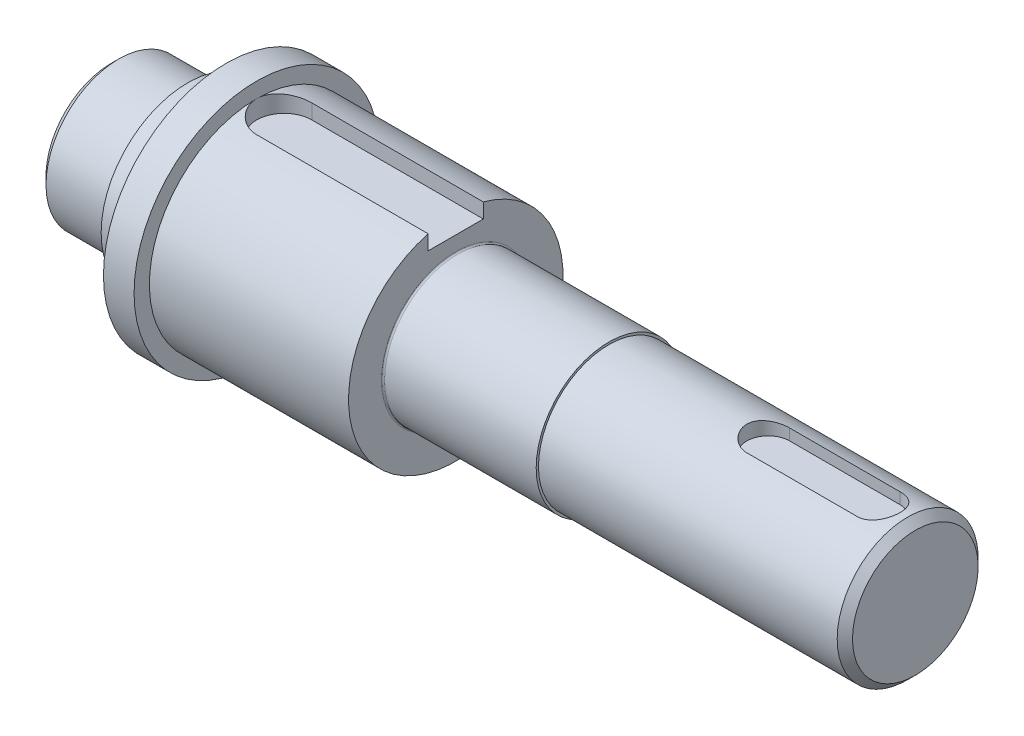
ISO-10303-21;
HEADER;
FILE_DESCRIPTION(('STEP AP214'),'2;1');
FILE_NAME('part.step','',(''),(''),'','','');
FILE_SCHEMA(('AUTOMOTIVE_DESIGN { 1 0 10303 214 1 1 1 1 }'));
ENDSEC;
DATA;
#1=APPLICATION_CONTEXT('core data for automotive mechanical design processes');
#2=APPLICATION_PROTOCOL_DEFINITION('international standard','automotive_design',2000,#1);
#3=PRODUCT_CONTEXT('',#1,'mechanical');
#4=PRODUCT('Part','Part','',(#3));
#5=PRODUCT_RELATED_PRODUCT_CATEGORY('part','',(#4));
#6=PRODUCT_DEFINITION_FORMATION('','',#4);
#7=PRODUCT_DEFINITION_CONTEXT('part definition',#1,'design');
#8=PRODUCT_DEFINITION('design','',#6,#7);
#9=PRODUCT_DEFINITION_SHAPE('','',#8);
#10=(LENGTH_UNIT() NAMED_UNIT(*) SI_UNIT(.MILLI.,.METRE.));
#11=(NAMED_UNIT(*) PLANE_ANGLE_UNIT() SI_UNIT($,.RADIAN.));
#12=(NAMED_UNIT(*) SI_UNIT($,.STERADIAN.) SOLID_ANGLE_UNIT());
#13=UNCERTAINTY_MEASURE_WITH_UNIT(LENGTH_MEASURE(1.E-05),#10,'distance_accuracy_value','');
#14=(GEOMETRIC_REPRESENTATION_CONTEXT(3) GLOBAL_UNCERTAINTY_ASSIGNED_CONTEXT((#13)) GLOBAL_UNIT_ASSIGNED_CONTEXT((#10,
#11,#12)) REPRESENTATION_CONTEXT('',''));
#15=CARTESIAN_POINT('',(0.,0.,0.));
#16=DIRECTION('',(0.,0.,1.));
#17=DIRECTION('',(1.,0.,0.));
#18=AXIS2_PLACEMENT_3D('',#15,#16,#17);
#19=CARTESIAN_POINT('',(0.,0.,0.));
#20=DIRECTION('',(-1.,0.,0.));
#21=DIRECTION('',(0.,0.,1.));
#22=AXIS2_PLACEMENT_3D('',#19,#20,#21);
#23=CYLINDRICAL_SURFACE('',#22,46.);
#24=CARTESIAN_POINT('',(520.,0.,0.));
#25=DIRECTION('',(-1.,0.,0.));
#26=DIRECTION('',(0.,0.,1.));
#27=AXIS2_PLACEMENT_3D('',#24,#25,#26);
#28=CIRCLE('',#27,46.);
#29=CARTESIAN_POINT('',(520.,0.,46.));
#30=VERTEX_POINT('',#29);
#31=EDGE_CURVE('E245',#30,#30,#28,.T.);
#32=ORIENTED_EDGE('',*,*,#31,.T.);
#33=EDGE_LOOP('',(#32));
#34=FACE_BOUND('',#33,.T.);
#35=CARTESIAN_POINT('',(325.,0.,0.));
#36=DIRECTION('',(-1.,0.,0.));
#37=DIRECTION('',(0.,0.,1.));
#38=AXIS2_PLACEMENT_3D('',#35,#36,#37);
#39=CIRCLE('',#38,46.);
#40=CARTESIAN_POINT('',(325.,0.,46.));
#41=VERTEX_POINT('',#40);
#42=EDGE_CURVE('E161',#41,#41,#39,.T.);
#43=ORIENTED_EDGE('',*,*,#42,.F.);
#44=EDGE_LOOP('',(#43));
#45=FACE_BOUND('',#44,.T.);
#46=CARTESIAN_POINT('',(429.,43.8178046004132,-14.0000000000001));
#47=CARTESIAN_POINT('',(428.808016477527,43.8178026072066,-14.0000003791292));
#48=CARTESIAN_POINT('',(428.616057469204,43.8190667976287,-13.99605026024));
#49=CARTESIAN_POINT('',(428.232499752168,43.8241064703167,-13.9802643563665));
#50=CARTESIAN_POINT('',(428.040901038226,43.827881915848,-13.9684286867325));
#51=CARTESIAN_POINT('',(427.467278153187,43.8429390022549,-13.921130548521));
#52=CARTESIAN_POINT('',(427.086251672709,43.85795143055,-13.8738769198669));
#53=CARTESIAN_POINT('',(426.330876614656,43.8974057431773,-13.7485286148941));
#54=CARTESIAN_POINT('',(425.95651333438,43.9218231794544,-13.6705138888366));
#55=CARTESIAN_POINT('',(425.21602607631,43.979338463641,-13.4843343320782));
#56=CARTESIAN_POINT('',(424.849902324338,44.0124365491475,-13.3761686761147));
#57=CARTESIAN_POINT('',(424.128570041615,44.0863032877923,-13.1306613713317));
#58=CARTESIAN_POINT('',(423.773356636915,44.127068456107,-12.9933329738432));
#59=CARTESIAN_POINT('',(423.075949739745,44.2150957029651,-12.6905536424603));
#60=CARTESIAN_POINT('',(422.733756875908,44.262358094688,-12.5251013528452));
#61=CARTESIAN_POINT('',(422.064390600993,44.3620680529808,-12.1672272126644));
#62=CARTESIAN_POINT('',(421.737223497765,44.4145177685855,-11.9747941704494));
#63=CARTESIAN_POINT('',(421.10001443105,44.5231534041412,-11.5643359403464));
#64=CARTESIAN_POINT('',(420.789972801354,44.5793393968688,-11.3463102538913));
#65=CARTESIAN_POINT('',(420.180071702229,44.6956252321281,-10.8793671747307));
#66=CARTESIAN_POINT('',(419.88077200868,44.7557914099423,-10.6297348612851));
#67=CARTESIAN_POINT('',(419.303969163493,44.876869851041,-10.1063697698827));
#68=CARTESIAN_POINT('',(419.026475540252,44.9377824271816,-9.83262656600234));
#69=CARTESIAN_POINT('',(418.495126988898,45.0586884101858,-9.26279793942464));
#70=CARTESIAN_POINT('',(418.241276404025,45.1186816464817,-8.96670842971182));
#71=CARTESIAN_POINT('',(417.759044456002,45.236096214272,-8.35420718603722));
#72=CARTESIAN_POINT('',(417.530651777924,45.2935186815159,-8.03780457969973));
#73=CARTESIAN_POINT('',(417.096127077171,45.4054749499475,-7.37947806297961));
#74=CARTESIAN_POINT('',(416.890583458574,45.4599193952635,-7.0371501391523));
#75=CARTESIAN_POINT('',(416.509165147539,45.5630028202005,-6.33549475097594));
#76=CARTESIAN_POINT('',(416.33329100782,45.6116416916635,-5.97616697009315));
#77=CARTESIAN_POINT('',(416.012695451283,45.7017111709396,-5.24308386316691));
#78=CARTESIAN_POINT('',(415.867967388245,45.7431433162238,-4.86933163525164));
#79=CARTESIAN_POINT('',(415.610892009398,45.8176064559995,-4.11003923085635));
#80=CARTESIAN_POINT('',(415.49854355103,45.8506377469214,-3.7244994708461));
#81=CARTESIAN_POINT('',(415.310078236466,45.9064929940652,-2.95600123483271));
#82=CARTESIAN_POINT('',(415.232994064423,45.9295882763462,-2.57329958310961));
#83=CARTESIAN_POINT('',(415.111017386373,45.9662968471682,-1.80234863934502));
#84=CARTESIAN_POINT('',(415.066124309098,45.9799103039754,-1.41409944587609));
#85=CARTESIAN_POINT('',(415.008958840718,45.9972661100852,-0.635051333034734));
#86=CARTESIAN_POINT('',(414.996681035649,46.0010100976674,-0.244252847629227));
#87=CARTESIAN_POINT('',(415.004849027199,45.9985242425766,0.536966322970943));
#88=CARTESIAN_POINT('',(415.025294204118,45.9922945887819,0.927387015180056));
#89=CARTESIAN_POINT('',(415.097502699141,45.9704068181765,1.69209973135658));
#90=CARTESIAN_POINT('',(415.148216047953,45.9550648795091,2.06650053081219));
#91=CARTESIAN_POINT('',(415.279617148035,45.9156289366815,2.80952425705504));
#92=CARTESIAN_POINT('',(415.360304127961,45.8915351577423,3.17814733227237));
#93=CARTESIAN_POINT('',(415.55096802643,45.8352285284632,3.90710663009459));
#94=CARTESIAN_POINT('',(415.660945699974,45.8030154688411,4.26744263883112));
#95=CARTESIAN_POINT('',(415.909296921979,45.7313063730948,4.97744378220474));
#96=CARTESIAN_POINT('',(416.047671019999,45.6918101960217,5.3271087101736));
#97=CARTESIAN_POINT('',(416.35355207776,45.606039593013,6.01760992518801));
#98=CARTESIAN_POINT('',(416.521384591041,45.5596904452226,6.35829265088755));
#99=CARTESIAN_POINT('',(416.883790247992,45.4617654028304,7.02432948759955));
#100=CARTESIAN_POINT('',(417.078363499788,45.4101894870943,7.34968353662296));
#101=CARTESIAN_POINT('',(417.492896932306,45.3031272744725,7.98309710684045));
#102=CARTESIAN_POINT('',(417.712856446663,45.247641080243,8.29115708167298));
#103=CARTESIAN_POINT('',(418.176834707228,45.1341367141294,8.88831446917412));
#104=CARTESIAN_POINT('',(418.420864373929,45.0761173996982,9.17740317471239));
#105=CARTESIAN_POINT('',(418.941500110936,44.9567205222528,9.74581598323813));
#106=CARTESIAN_POINT('',(419.219013037016,44.8953009103207,10.0243012828142));
#107=CARTESIAN_POINT('',(419.796417045997,44.7730541259373,10.5569062883511));
#108=CARTESIAN_POINT('',(420.096299167083,44.7122267271512,10.8110356598299));
#109=CARTESIAN_POINT('',(420.716817056786,44.5928065796725,11.2935119741496));
#110=CARTESIAN_POINT('',(421.037463680165,44.5342150256325,11.5218452579556));
#111=CARTESIAN_POINT('',(421.69733277494,44.4209784105452,11.9509807485822));
#112=CARTESIAN_POINT('',(422.036554705086,44.3663332346152,12.1517837569873));
#113=CARTESIAN_POINT('',(422.735131415444,44.2620384936384,12.5263792545818));
#114=CARTESIAN_POINT('',(423.094663250483,44.2124488637307,12.6998585948245));
#115=CARTESIAN_POINT('',(423.828003810823,44.1204855666143,13.0157532969176));
#116=CARTESIAN_POINT('',(424.201811779981,44.0781115178751,13.1581703013294));
#117=CARTESIAN_POINT('',(424.960571212164,44.0019854056831,13.4105429885953));
#118=CARTESIAN_POINT('',(425.34550827732,43.9682227124759,13.5205387182566));
#119=CARTESIAN_POINT('',(426.12392348623,43.9103771939569,13.7072353102855));
#120=CARTESIAN_POINT('',(426.517397607768,43.8862899101779,13.7839515092993));
#121=CARTESIAN_POINT('',(427.258796483396,43.8510332529464,13.8956826672918));
#122=CARTESIAN_POINT('',(427.606048603897,43.838598221824,13.9348007256099));
#123=CARTESIAN_POINT('',(428.302191616069,43.8219713702484,13.986956751027));
#124=CARTESIAN_POINT('',(428.651079389642,43.8177675867537,14.0000325675922));
#125=CARTESIAN_POINT('',(429.,43.8178046004133,13.9999999999999));
#126=B_SPLINE_CURVE_WITH_KNOTS('',3,(#46,#47,#48,#49,#50,#51,#52,#53,#54,#55,#56,#57,#58,#59,
#60,#61,#62,#63,#64,#65,#66,#67,#68,#69,#70,#71,#72,#73,#74,#75,#76,#77,#78,#79,#80,#81,#82,#83,
#84,#85,#86,#87,#88,#89,#90,#91,#92,#93,#94,#95,#96,#97,#98,#99,#100,#101,#102,#103,#104,#105,
#106,#107,#108,#109,#110,#111,#112,#113,#114,#115,#116,#117,#118,#119,#120,#121,#122,#123,#124,
#125),.UNSPECIFIED.,.F.,.F.,(4,2,2,2,2,2,2,2,2,2,2,2,2,2,2,2,2,2,2,2,2,2,2,2,2,2,2,2,2,2,2,2,2,
2,2,2,2,2,2,4),(0.,0.57585700293327,1.15170558236791,2.30287781424274,3.45107758427866,
4.59930878483595,5.74701934990801,6.89478525641502,8.04302867394113,9.19129446396926,
10.3730125531588,11.5552441681183,12.7376925331311,13.9196132381011,15.1271007637685,
16.3346107814537,17.5418628741533,18.749072362151,19.9208218247336,21.0925504926876,
22.2640846476332,23.4355966166192,24.5686565021775,25.7016872314902,26.8347471687432,
27.9678290362114,29.1143274042595,30.2608304083411,31.4073033245966,32.5542988028446,
33.7466727172167,34.938571467959,36.131098400401,37.3235906032877,38.5288861302863,
39.734117906379,40.9378546789789,42.1410361268011,43.1889921391357,44.2354239506839),.UNSPECIFIED.);
#127=CARTESIAN_POINT('',(429.,43.8178046004132,-14.));
#128=VERTEX_POINT('',#127);
#129=CARTESIAN_POINT('',(429.,43.8178046004132,14.));
#130=VERTEX_POINT('',#129);
#131=EDGE_CURVE('E111',#128,#130,#126,.T.);
#132=ORIENTED_EDGE('',*,*,#131,.F.);
#133=DIRECTION('',(-1.,0.,0.));
#134=VECTOR('',#133,1.);
#135=CARTESIAN_POINT('',(0.,43.8178046004132,-14.));
#136=LINE('',#135,#134);
#137=CARTESIAN_POINT('',(501.,43.8178046004132,-14.));
#138=VERTEX_POINT('',#137);
#139=EDGE_CURVE('E198',#138,#128,#136,.T.);
#140=ORIENTED_EDGE('',*,*,#139,.F.);
#141=CARTESIAN_POINT('',(501.,43.8178046004133,14.));
#142=CARTESIAN_POINT('',(501.191983522473,43.8178026072067,14.0000003791291));
#143=CARTESIAN_POINT('',(501.383942530796,43.8190667976287,13.9960502602399));
#144=CARTESIAN_POINT('',(501.767500247832,43.8241064703168,13.9802643563664));
#145=CARTESIAN_POINT('',(501.959098961775,43.827881915848,13.9684286867325));
#146=CARTESIAN_POINT('',(502.532721846813,43.8429390022549,13.921130548521));
#147=CARTESIAN_POINT('',(502.913748327291,43.85795143055,13.8738769198668));
#148=CARTESIAN_POINT('',(503.669123385345,43.8974057431773,13.7485286148941));
#149=CARTESIAN_POINT('',(504.04348666562,43.9218231794544,13.6705138888365));
#150=CARTESIAN_POINT('',(504.78397392369,43.979338463641,13.4843343320781));
#151=CARTESIAN_POINT('',(505.150097675662,44.0124365491475,13.3761686761146));
#152=CARTESIAN_POINT('',(505.871429958385,44.0863032877923,13.1306613713316));
#153=CARTESIAN_POINT('',(506.226643363086,44.1270684561071,12.9933329738431));
#154=CARTESIAN_POINT('',(506.924050260256,44.2150957029651,12.6905536424603));
#155=CARTESIAN_POINT('',(507.266243124093,44.262358094688,12.5251013528451));
#156=CARTESIAN_POINT('',(507.935609399007,44.3620680529808,12.1672272126643));
#157=CARTESIAN_POINT('',(508.262776502235,44.4145177685856,11.9747941704493));
#158=CARTESIAN_POINT('',(508.899985568951,44.5231534041412,11.5643359403463));
#159=CARTESIAN_POINT('',(509.210027198646,44.5793393968688,11.3463102538913));
#160=CARTESIAN_POINT('',(509.819928297771,44.6956252321281,10.8793671747306));
#161=CARTESIAN_POINT('',(510.119227991321,44.7557914099423,10.629734861285));
#162=CARTESIAN_POINT('',(510.696030836507,44.876869851041,10.1063697698826));
#163=CARTESIAN_POINT('',(510.973524459748,44.9377824271816,9.83262656600228));
#164=CARTESIAN_POINT('',(511.504873011103,45.0586884101859,9.26279793942458));
#165=CARTESIAN_POINT('',(511.758723595975,45.1186816464817,8.96670842971175));
#166=CARTESIAN_POINT('',(512.240955543998,45.236096214272,8.35420718603713));
#167=CARTESIAN_POINT('',(512.469348222076,45.2935186815159,8.03780457969964));
#168=CARTESIAN_POINT('',(512.903872922829,45.4054749499475,7.37947806297949));
#169=CARTESIAN_POINT('',(513.109416541427,45.4599193952635,7.03715013915216));
#170=CARTESIAN_POINT('',(513.490834852461,45.5630028202005,6.33549475097581));
#171=CARTESIAN_POINT('',(513.66670899218,45.6116416916635,5.97616697009305));
#172=CARTESIAN_POINT('',(513.987304548718,45.7017111709396,5.24308386316684));
#173=CARTESIAN_POINT('',(514.132032611755,45.7431433162238,4.86933163525157));
#174=CARTESIAN_POINT('',(514.389107990602,45.8176064559995,4.11003923085629));
#175=CARTESIAN_POINT('',(514.50145644897,45.8506377469214,3.72449947084604));
#176=CARTESIAN_POINT('',(514.689921763534,45.9064929940652,2.95600123483265));
#177=CARTESIAN_POINT('',(514.767005935578,45.9295882763462,2.57329958310956));
#178=CARTESIAN_POINT('',(514.888982613627,45.9662968471682,1.80234863934498));
#179=CARTESIAN_POINT('',(514.933875690903,45.9799103039754,1.41409944587604));
#180=CARTESIAN_POINT('',(514.991041159282,45.9972661100852,0.635051333034675));
#181=CARTESIAN_POINT('',(515.003318964351,46.0010100976674,0.244252847629169));
#182=CARTESIAN_POINT('',(514.995150972801,45.9985242425766,-0.536966322970998));
#183=CARTESIAN_POINT('',(514.974705795882,45.9922945887819,-0.927387015180106));
#184=CARTESIAN_POINT('',(514.90249730086,45.9704068181765,-1.69209973135663));
#185=CARTESIAN_POINT('',(514.851783952048,45.9550648795091,-2.06650053081226));
#186=CARTESIAN_POINT('',(514.720382851965,45.9156289366815,-2.80952425705511));
#187=CARTESIAN_POINT('',(514.639695872039,45.8915351577423,-3.17814733227242));
#188=CARTESIAN_POINT('',(514.44903197357,45.8352285284632,-3.90710663009465));
#189=CARTESIAN_POINT('',(514.339054300027,45.8030154688411,-4.26744263883119));
#190=CARTESIAN_POINT('',(514.090703078021,45.7313063730948,-4.97744378220482));
#191=CARTESIAN_POINT('',(513.952328980002,45.6918101960217,-5.32710871017367));
#192=CARTESIAN_POINT('',(513.64644792224,45.6060395930129,-6.01760992518806));
#193=CARTESIAN_POINT('',(513.478615408959,45.5596904452225,-6.35829265088759));
#194=CARTESIAN_POINT('',(513.116209752009,45.4617654028304,-7.0243294875996));
#195=CARTESIAN_POINT('',(512.921636500213,45.4101894870943,-7.34968353662302));
#196=CARTESIAN_POINT('',(512.507103067694,45.3031272744725,-7.98309710684051));
#197=CARTESIAN_POINT('',(512.287143553338,45.247641080243,-8.29115708167303));
#198=CARTESIAN_POINT('',(511.823165292773,45.1341367141294,-8.88831446917416));
#199=CARTESIAN_POINT('',(511.579135626071,45.0761173996982,-9.17740317471244));
#200=CARTESIAN_POINT('',(511.058499889064,44.9567205222528,-9.74581598323818));
#201=CARTESIAN_POINT('',(510.780986962984,44.8953009103207,-10.0243012828143));
#202=CARTESIAN_POINT('',(510.203582954003,44.7730541259373,-10.5569062883511));
#203=CARTESIAN_POINT('',(509.903700832917,44.7122267271512,-10.8110356598299));
#204=CARTESIAN_POINT('',(509.283182943214,44.5928065796725,-11.2935119741496));
#205=CARTESIAN_POINT('',(508.962536319835,44.5342150256325,-11.5218452579556));
#206=CARTESIAN_POINT('',(508.30266722506,44.4209784105452,-11.9509807485822));
#207=CARTESIAN_POINT('',(507.963445294915,44.3663332346153,-12.1517837569873));
#208=CARTESIAN_POINT('',(507.264868584556,44.2620384936384,-12.5263792545818));
#209=CARTESIAN_POINT('',(506.905336749517,44.2124488637307,-12.6998585948245));
#210=CARTESIAN_POINT('',(506.171996189177,44.1204855666143,-13.0157532969177));
#211=CARTESIAN_POINT('',(505.798188220019,44.0781115178751,-13.1581703013295));
#212=CARTESIAN_POINT('',(505.039428787837,44.0019854056831,-13.4105429885953));
#213=CARTESIAN_POINT('',(504.65449172268,43.9682227124759,-13.5205387182566));
#214=CARTESIAN_POINT('',(503.87607651377,43.9103771939569,-13.7072353102856));
#215=CARTESIAN_POINT('',(503.482602392233,43.8862899101779,-13.7839515092993));
#216=CARTESIAN_POINT('',(502.741203516604,43.8510332529464,-13.8956826672918));
#217=CARTESIAN_POINT('',(502.393951396103,43.838598221824,-13.9348007256099));
#218=CARTESIAN_POINT('',(501.697808383931,43.8219713702484,-13.986956751027));
#219=CARTESIAN_POINT('',(501.348920610359,43.8177675867536,-14.0000325675923));
#220=CARTESIAN_POINT('',(501.,43.8178046004133,-14.));
#221=B_SPLINE_CURVE_WITH_KNOTS('',3,(#141,#142,#143,#144,#145,#146,#147,#148,#149,#150,#151,
#152,#153,#154,#155,#156,#157,#158,#159,#160,#161,#162,#163,#164,#165,#166,#167,#168,#169,#170,
#171,#172,#173,#174,#175,#176,#177,#178,#179,#180,#181,#182,#183,#184,#185,#186,#187,#188,#189,
#190,#191,#192,#193,#194,#195,#196,#197,#198,#199,#200,#201,#202,#203,#204,#205,#206,#207,#208,
#209,#210,#211,#212,#213,#214,#215,#216,#217,#218,#219,#220),.UNSPECIFIED.,.F.,.F.,(4,2,2,2,2,2,
2,2,2,2,2,2,2,2,2,2,2,2,2,2,2,2,2,2,2,2,2,2,2,2,2,2,2,2,2,2,2,2,2,4),(0.,0.57585700293327,
1.1517055823678,2.30287781424268,3.45107758427866,4.59930878483595,5.74701934990807,
6.89478525641508,8.04302867394125,9.19129446396919,10.3730125531588,11.5552441681183,
12.7376925331312,13.9196132381012,15.1271007637686,16.3346107814537,17.5418628741533,
18.749072362151,19.9208218247336,21.0925504926876,22.2640846476332,23.4355966166192,
24.5686565021775,25.7016872314902,26.8347471687432,27.9678290362113,29.1143274042594,
30.2608304083411,31.4073033245966,32.5542988028445,33.7466727172166,34.9385714679589,
36.1310984004008,37.3235906032876,38.5288861302862,39.7341179063789,40.9378546789788,
42.141036126801,43.1889921391357,44.235423950684),.UNSPECIFIED.);
#222=CARTESIAN_POINT('',(501.,43.8178046004133,14.));
#223=VERTEX_POINT('',#222);
#224=EDGE_CURVE('E232',#223,#138,#221,.T.);
#225=ORIENTED_EDGE('',*,*,#224,.F.);
#226=DIRECTION('',(-1.,0.,0.));
#227=VECTOR('',#226,1.);
#228=CARTESIAN_POINT('',(0.,43.8178046004132,14.0000000000001));
#229=LINE('',#228,#227);
#230=EDGE_CURVE('E246',#130,#223,#229,.F.);
#231=ORIENTED_EDGE('',*,*,#230,.F.);
#232=EDGE_LOOP('',(#132,#140,#225,#231));
#233=FACE_BOUND('',#232,.T.);
#234=ADVANCED_FACE('F34',(#34,#45,#233),#23,.T.);
#235=CARTESIAN_POINT('',(0.,0.,0.));
#236=DIRECTION('',(1.,0.,0.));
#237=DIRECTION('',(0.,0.,-1.));
#238=AXIS2_PLACEMENT_3D('',#235,#236,#237);
#239=PLANE('',#238);
#240=CARTESIAN_POINT('',(0.,0.,0.));
#241=DIRECTION('',(1.,0.,0.));
#242=DIRECTION('',(0.,0.,-1.));
#243=AXIS2_PLACEMENT_3D('',#240,#241,#242);
#244=CIRCLE('',#243,42.5000000000001);
#245=CARTESIAN_POINT('',(0.,0.,-42.5000000000001));
#246=VERTEX_POINT('',#245);
#247=EDGE_CURVE('E329',#246,#246,#244,.F.);
#248=ORIENTED_EDGE('',*,*,#247,.T.);
#249=EDGE_LOOP('',(#248));
#250=FACE_BOUND('',#249,.T.);
#251=ADVANCED_FACE('F228',(#250),#239,.F.);
#252=CARTESIAN_POINT('',(0.,0.,0.));
#253=DIRECTION('',(-1.,0.,0.));
#254=DIRECTION('',(0.,0.,1.));
#255=AXIS2_PLACEMENT_3D('',#252,#253,#254);
#256=CYLINDRICAL_SURFACE('',#255,47.5);
#257=CARTESIAN_POINT('',(4.99999999999992,0.,0.));
#258=DIRECTION('',(1.,0.,0.));
#259=DIRECTION('',(0.,0.,-1.));
#260=AXIS2_PLACEMENT_3D('',#257,#258,#259);
#261=CIRCLE('',#260,47.5);
#262=CARTESIAN_POINT('',(4.99999999999992,0.,-47.5));
#263=VERTEX_POINT('',#262);
#264=EDGE_CURVE('E327',#263,#263,#261,.T.);
#265=ORIENTED_EDGE('',*,*,#264,.T.);
#266=EDGE_LOOP('',(#265));
#267=FACE_BOUND('',#266,.T.);
#268=CARTESIAN_POINT('',(50.,0.,0.));
#269=DIRECTION('',(-1.,0.,0.));
#270=DIRECTION('',(0.,0.,1.));
#271=AXIS2_PLACEMENT_3D('',#268,#269,#270);
#272=CIRCLE('',#271,47.5);
#273=CARTESIAN_POINT('',(50.,0.,47.5));
#274=VERTEX_POINT('',#273);
#275=EDGE_CURVE('E185',#274,#274,#272,.T.);
#276=ORIENTED_EDGE('',*,*,#275,.T.);
#277=EDGE_LOOP('',(#276));
#278=FACE_BOUND('',#277,.T.);
#279=ADVANCED_FACE('F277',(#267,#278),#256,.T.);
#280=CARTESIAN_POINT('',(50.,47.5,0.));
#281=DIRECTION('',(1.,0.,0.));
#282=DIRECTION('',(0.,0.,-1.));
#283=AXIS2_PLACEMENT_3D('',#280,#281,#282);
#284=PLANE('',#283);
#285=ORIENTED_EDGE('',*,*,#275,.F.);
#286=EDGE_LOOP('',(#285));
#287=FACE_BOUND('',#286,.T.);
#288=CARTESIAN_POINT('',(50.,0.,0.));
#289=DIRECTION('',(-1.,0.,0.));
#290=DIRECTION('',(0.,0.,1.));
#291=AXIS2_PLACEMENT_3D('',#288,#289,#290);
#292=CIRCLE('',#291,56.4999999999999);
#293=CARTESIAN_POINT('',(50.,0.,56.4999999999999));
#294=VERTEX_POINT('',#293);
#295=EDGE_CURVE('E182',#294,#294,#292,.T.);
#296=ORIENTED_EDGE('',*,*,#295,.T.);
#297=EDGE_LOOP('',(#296));
#298=FACE_BOUND('',#297,.T.);
#299=ADVANCED_FACE('F281',(#287,#298),#284,.F.);
#300=CARTESIAN_POINT('',(0.,0.,0.));
#301=DIRECTION('',(-1.,0.,0.));
#302=DIRECTION('',(0.,0.,1.));
#303=AXIS2_PLACEMENT_3D('',#300,#301,#302);
#304=CYLINDRICAL_SURFACE('',#303,56.4999999999999);
#305=ORIENTED_EDGE('',*,*,#295,.F.);
#306=EDGE_LOOP('',(#305));
#307=FACE_BOUND('',#306,.T.);
#308=CARTESIAN_POINT('',(75.,0.,0.));
#309=DIRECTION('',(-1.,0.,0.));
#310=DIRECTION('',(0.,0.,1.));
#311=AXIS2_PLACEMENT_3D('',#308,#309,#310);
#312=CIRCLE('',#311,56.4999999999999);
#313=CARTESIAN_POINT('',(75.,0.,56.4999999999999));
#314=VERTEX_POINT('',#313);
#315=EDGE_CURVE('E179',#314,#314,#312,.T.);
#316=ORIENTED_EDGE('',*,*,#315,.T.);
#317=EDGE_LOOP('',(#316));
#318=FACE_BOUND('',#317,.T.);
#319=ADVANCED_FACE('F285',(#307,#318),#304,.T.);
#320=CARTESIAN_POINT('',(75.,56.4999999999999,0.));
#321=DIRECTION('',(1.,0.,0.));
#322=DIRECTION('',(0.,0.,-1.));
#323=AXIS2_PLACEMENT_3D('',#320,#321,#322);
#324=PLANE('',#323);
#325=ORIENTED_EDGE('',*,*,#315,.F.);
#326=EDGE_LOOP('',(#325));
#327=FACE_BOUND('',#326,.T.);
#328=CARTESIAN_POINT('',(75.,0.,0.));
#329=DIRECTION('',(-1.,0.,0.));
#330=DIRECTION('',(0.,0.,1.));
#331=AXIS2_PLACEMENT_3D('',#328,#329,#330);
#332=CIRCLE('',#331,79.9999999999999);
#333=CARTESIAN_POINT('',(75.,0.,79.9999999999999));
#334=VERTEX_POINT('',#333);
#335=EDGE_CURVE('E176',#334,#334,#332,.T.);
#336=ORIENTED_EDGE('',*,*,#335,.T.);
#337=EDGE_LOOP('',(#336));
#338=FACE_BOUND('',#337,.T.);
#339=ADVANCED_FACE('F289',(#327,#338),#324,.F.);
#340=CARTESIAN_POINT('',(0.,0.,0.));
#341=DIRECTION('',(-1.,0.,0.));
#342=DIRECTION('',(0.,0.,1.));
#343=AXIS2_PLACEMENT_3D('',#340,#341,#342);
#344=CYLINDRICAL_SURFACE('',#343,79.9999999999999);
#345=ORIENTED_EDGE('',*,*,#335,.F.);
#346=EDGE_LOOP('',(#345));
#347=FACE_BOUND('',#346,.T.);
#348=CARTESIAN_POINT('',(95.,0.,0.));
#349=DIRECTION('',(-1.,0.,0.));
#350=DIRECTION('',(0.,0.,1.));
#351=AXIS2_PLACEMENT_3D('',#348,#349,#350);
#352=CIRCLE('',#351,79.9999999999999);
#353=CARTESIAN_POINT('',(95.,0.,79.9999999999999));
#354=VERTEX_POINT('',#353);
#355=EDGE_CURVE('E173',#354,#354,#352,.T.);
#356=ORIENTED_EDGE('',*,*,#355,.T.);
#357=EDGE_LOOP('',(#356));
#358=FACE_BOUND('',#357,.T.);
#359=ADVANCED_FACE('F293',(#347,#358),#344,.T.);
#360=CARTESIAN_POINT('',(95.,79.9999999999999,0.));
#361=DIRECTION('',(-1.,0.,0.));
#362=DIRECTION('',(0.,0.,1.));
#363=AXIS2_PLACEMENT_3D('',#360,#361,#362);
#364=PLANE('',#363);
#365=ORIENTED_EDGE('',*,*,#355,.F.);
#366=EDGE_LOOP('',(#365));
#367=FACE_BOUND('',#366,.T.);
#368=CARTESIAN_POINT('',(95.,0.,0.));
#369=DIRECTION('',(-1.,0.,0.));
#370=DIRECTION('',(0.,0.,1.));
#371=AXIS2_PLACEMENT_3D('',#368,#369,#370);
#372=CIRCLE('',#371,70.);
#373=CARTESIAN_POINT('',(95.,70.,0.));
#374=VERTEX_POINT('',#373);
#375=EDGE_CURVE('E170',#374,#374,#372,.T.);
#376=ORIENTED_EDGE('',*,*,#375,.T.);
#377=EDGE_LOOP('',(#376));
#378=FACE_BOUND('',#377,.T.);
#379=ADVANCED_FACE('F296',(#367,#378),#364,.F.);
#380=CARTESIAN_POINT('',(0.,0.,0.));
#381=DIRECTION('',(-1.,0.,0.));
#382=DIRECTION('',(0.,0.,1.));
#383=AXIS2_PLACEMENT_3D('',#380,#381,#382);
#384=CYLINDRICAL_SURFACE('',#383,70.);
#385=CARTESIAN_POINT('',(225.,0.,0.));
#386=DIRECTION('',(-1.,0.,0.));
#387=DIRECTION('',(0.,0.,1.));
#388=AXIS2_PLACEMENT_3D('',#385,#386,#387);
#389=CIRCLE('',#388,70.);
#390=CARTESIAN_POINT('',(225.,67.646138101151,-18.));
#391=VERTEX_POINT('',#390);
#392=CARTESIAN_POINT('',(225.,67.646138101151,18.));
#393=VERTEX_POINT('',#392);
#394=EDGE_CURVE('E167',#391,#393,#389,.T.);
#395=ORIENTED_EDGE('',*,*,#394,.T.);
#396=DIRECTION('',(-1.,0.,0.));
#397=VECTOR('',#396,1.);
#398=CARTESIAN_POINT('',(0.,67.646138101151,18.));
#399=LINE('',#398,#397);
#400=CARTESIAN_POINT('',(113.,67.646138101151,18.));
#401=VERTEX_POINT('',#400);
#402=EDGE_CURVE('E158',#393,#401,#399,.T.);
#403=ORIENTED_EDGE('',*,*,#402,.T.);
#404=CARTESIAN_POINT('',(113.,67.646138101151,18.));
#405=CARTESIAN_POINT('',(112.751337850749,67.6461360267012,18.0000002617822));
#406=CARTESIAN_POINT('',(112.502707038729,67.6475096882484,17.9948463683339));
#407=CARTESIAN_POINT('',(112.005909815661,67.6529863333406,17.9742483702358));
#408=CARTESIAN_POINT('',(111.75774339047,67.6570892323631,17.9588045842571));
#409=CARTESIAN_POINT('',(111.014713220962,67.6734544385533,17.8970810950666));
#410=CARTESIAN_POINT('',(110.521124167261,67.6897732885077,17.8354092297225));
#411=CARTESIAN_POINT('',(109.542253006459,67.7326897308545,17.6717239977381));
#412=CARTESIAN_POINT('',(109.056955952655,67.7592661967937,17.5697935371889));
#413=CARTESIAN_POINT('',(108.096970533372,67.8219014363319,17.3264381130102));
#414=CARTESIAN_POINT('',(107.622282330832,67.8579603554623,17.1850125432294));
#415=CARTESIAN_POINT('',(106.686909806986,67.9384865365431,16.8638495745743));
#416=CARTESIAN_POINT('',(106.226223032,67.9829523152568,16.6841189332181));
#417=CARTESIAN_POINT('',(105.321748574385,68.0790229928555,16.2876701493709));
#418=CARTESIAN_POINT('',(104.877961313359,68.130628069701,16.0709510848417));
#419=CARTESIAN_POINT('',(104.227172980216,68.2122867014899,15.7193637033397));
#420=CARTESIAN_POINT('',(104.012664595141,68.2402236105065,15.597710006824));
#421=CARTESIAN_POINT('',(103.588997220152,68.2973127959796,15.3458055020224));
#422=CARTESIAN_POINT('',(103.379836872906,68.326464759015,15.2155569057824));
#423=CARTESIAN_POINT('',(102.76075546886,68.4154617412657,14.8121719481031));
#424=CARTESIAN_POINT('',(102.359203631556,68.476851713994,14.5263799744546));
#425=CARTESIAN_POINT('',(101.573036523337,68.6033655183166,13.9167929107987));
#426=CARTESIAN_POINT('',(101.188949134076,68.6685405199074,13.5923295483977));
#427=CARTESIAN_POINT('',(100.449297992141,68.79961944117,12.9124812774877));
#428=CARTESIAN_POINT('',(100.093734648083,68.8655233712685,12.5570959261636));
#429=CARTESIAN_POINT('',(99.4134251122197,68.9962573515693,11.8176741456535));
#430=CARTESIAN_POINT('',(99.0886837758404,69.0610872312518,11.4336332192871));
#431=CARTESIAN_POINT('',(98.4722598372068,69.187890805408,10.6394289112758));
#432=CARTESIAN_POINT('',(98.1805773781758,69.2498644875069,10.2292654164703));
#433=CARTESIAN_POINT('',(97.6282346381749,69.3701478308742,9.37920784477121));
#434=CARTESIAN_POINT('',(97.3680994276802,69.4283894053286,8.93896268868589));
#435=CARTESIAN_POINT('',(96.8859345645543,69.5385360041604,8.03730434013184));
#436=CARTESIAN_POINT('',(96.6639054074953,69.590440946127,7.57589087246633));
#437=CARTESIAN_POINT('',(96.2597477820757,69.6864225980842,6.63520625940301));
#438=CARTESIAN_POINT('',(96.0776125593721,69.7305006329894,6.15593815303222));
#439=CARTESIAN_POINT('',(95.7547127323412,69.8095652798993,5.18293326477586));
#440=CARTESIAN_POINT('',(95.6139471056896,69.844552116563,4.68919684076267));
#441=CARTESIAN_POINT('',(95.3775566044823,69.9037745513574,3.70159021718052));
#442=CARTESIAN_POINT('',(95.2810316603341,69.928223853887,3.20794818951382));
#443=CARTESIAN_POINT('',(95.1295970643399,69.9667487068648,2.21391977525017));
#444=CARTESIAN_POINT('',(95.074686877954,69.9808243905615,1.71353347536717));
#445=CARTESIAN_POINT('',(95.0069682056547,69.9982008294628,0.709790372256575));
#446=CARTESIAN_POINT('',(94.9941549308981,70.0015028102576,0.206433913433829));
#447=CARTESIAN_POINT('',(95.010731060686,69.9972408715302,-0.79953383870977));
#448=CARTESIAN_POINT('',(95.0401199090689,69.9896770952026,-1.3021451417633));
#449=CARTESIAN_POINT('',(95.1396515001491,69.9642037866637,-2.29109332588839));
#450=CARTESIAN_POINT('',(95.2088199282429,69.9465416502981,-2.77753502455113));
#451=CARTESIAN_POINT('',(95.3865677811563,69.9015422530849,-3.74269722226201));
#452=CARTESIAN_POINT('',(95.4951464826436,69.8742051698105,-4.22141786285329));
#453=CARTESIAN_POINT('',(95.7508376470736,69.8105886311048,-5.16785159184355));
#454=CARTESIAN_POINT('',(95.8979510561929,69.7743089560995,-5.63556440965042));
#455=CARTESIAN_POINT('',(96.2295612354977,69.6937713474259,-6.55683389629138));
#456=CARTESIAN_POINT('',(96.41405856008,69.6495132954409,-7.01039035507407));
#457=CARTESIAN_POINT('',(96.8209637190663,69.5537329380391,-7.90457716761012));
#458=CARTESIAN_POINT('',(97.0437123091045,69.5021461287392,-8.3450455040893));
#459=CARTESIAN_POINT('',(97.5242713112979,69.3933961096216,-9.20569084265107));
#460=CARTESIAN_POINT('',(97.7820818520515,69.3362328793512,-9.62586777030228));
#461=CARTESIAN_POINT('',(98.3310133186193,69.217825453859,-10.4433354956026));
#462=CARTESIAN_POINT('',(98.6221386112029,69.1565807240905,-10.8406232827467));
#463=CARTESIAN_POINT('',(99.2357392782173,69.0316207870663,-11.609787918695));
#464=CARTESIAN_POINT('',(99.5582152208017,68.967905535051,-11.9816643067719));
#465=CARTESIAN_POINT('',(100.242077827514,68.8378438286138,-12.7079195478598));
#466=CARTESIAN_POINT('',(100.604311875022,68.771474155153,-13.0614969877642));
#467=CARTESIAN_POINT('',(101.357354435368,68.6397389483427,-13.7369826972756));
#468=CARTESIAN_POINT('',(101.748163696962,68.5743734413597,-14.058890136516));
#469=CARTESIAN_POINT('',(102.555985864555,68.4464641217981,-14.6689721877392));
#470=CARTESIAN_POINT('',(102.973006394814,68.3839211394012,-14.9571369143006));
#471=CARTESIAN_POINT('',(103.615861219841,68.2936087089631,-15.3623616821972));
#472=CARTESIAN_POINT('',(103.833039733614,68.2640874728169,-15.4929361157212));
#473=CARTESIAN_POINT('',(104.272913567473,68.2064108308754,-15.7449110050485));
#474=CARTESIAN_POINT('',(104.495610386011,68.178255802341,-15.8663089319808));
#475=CARTESIAN_POINT('',(105.173945037191,68.0958520053485,-16.2176795019145));
#476=CARTESIAN_POINT('',(105.637410444359,68.0440077875115,-16.4333046247542));
#477=CARTESIAN_POINT('',(106.581711829049,67.9483176981048,-16.824587808261));
#478=CARTESIAN_POINT('',(107.062547304917,67.9044715957682,-17.0002470220867));
#479=CARTESIAN_POINT('',(107.793850286128,67.8457435470562,-17.2325677857009));
#480=CARTESIAN_POINT('',(108.039184547917,67.8273474895208,-17.3047888380468));
#481=CARTESIAN_POINT('',(108.532802065456,67.7930323817331,-17.4387366534861));
#482=CARTESIAN_POINT('',(108.781084569753,67.7771127142856,-17.5004660317949));
#483=CARTESIAN_POINT('',(109.529588156987,67.7332710974036,-17.669683615993));
#484=CARTESIAN_POINT('',(110.033749242724,67.709243503638,-17.7612914775966));
#485=CARTESIAN_POINT('',(110.948463908819,67.676015040873,-17.8874382484891));
#486=CARTESIAN_POINT('',(111.357917521928,67.6648270900921,-17.929659459774));
#487=CARTESIAN_POINT('',(112.178228166333,67.6498823110323,-17.9859279895308));
#488=CARTESIAN_POINT('',(112.58908188339,67.6461135656083,-18.0000204904276));
#489=CARTESIAN_POINT('',(113.,67.646138101151,-18.));
#490=B_SPLINE_CURVE_WITH_KNOTS('',3,(#404,#405,#406,#407,#408,#409,#410,#411,#412,#413,#414,
#415,#416,#417,#418,#419,#420,#421,#422,#423,#424,#425,#426,#427,#428,#429,#430,#431,#432,#433,
#434,#435,#436,#437,#438,#439,#440,#441,#442,#443,#444,#445,#446,#447,#448,#449,#450,#451,#452,
#453,#454,#455,#456,#457,#458,#459,#460,#461,#462,#463,#464,#465,#466,#467,#468,#469,#470,#471,
#472,#473,#474,#475,#476,#477,#478,#479,#480,#481,#482,#483,#484,#485,#486,#487,#488,#489),
.UNSPECIFIED.,.F.,.F.,(4,2,2,2,2,2,2,2,2,2,2,2,2,2,2,2,2,2,2,2,2,2,2,2,2,2,2,2,2,2,2,2,2,2,2,2,
2,2,2,2,2,2,4),(0.,0.745866836927004,1.49171057594097,2.98281674255724,4.47086809429568,
5.95894228515906,7.4467541771511,8.93460316236726,9.67896662125884,10.4231392469536,
11.9113804377068,13.4306598797923,14.9499610821406,16.4695012258044,17.9890479524249,
19.5311625740683,21.0732972495226,22.6151706278199,24.1570059001735,25.6659041274757,
27.1747829727113,28.6834901655845,30.1921774761073,31.6653974549191,33.1385903957599,
34.611819512592,36.0850704787466,37.5721999079638,39.0593347917399,40.5466648271961,
42.0340218218884,43.5637945002176,45.0936072774991,46.6238671204007,47.3890392845851,
48.1544215527054,49.6937908108544,51.2331156470905,52.0021126587293,52.7709177036936,
54.3076344176265,55.5419891432828,56.7743595559189),.UNSPECIFIED.);
#491=EDGE_CURVE('E197',#401,#374,#490,.T.);
#492=ORIENTED_EDGE('',*,*,#491,.T.);
#493=ORIENTED_EDGE('',*,*,#375,.F.);
#494=CARTESIAN_POINT('',(113.,67.646138101151,-18.));
#495=VERTEX_POINT('',#494);
#496=EDGE_CURVE('E188',#374,#495,#490,.T.);
#497=ORIENTED_EDGE('',*,*,#496,.T.);
#498=DIRECTION('',(-1.,0.,0.));
#499=VECTOR('',#498,1.);
#500=CARTESIAN_POINT('',(0.,67.646138101151,-18.));
#501=LINE('',#500,#499);
#502=EDGE_CURVE('E148',#495,#391,#501,.F.);
#503=ORIENTED_EDGE('',*,*,#502,.T.);
#504=EDGE_LOOP('',(#395,#403,#492,#493,#497,#503));
#505=FACE_BOUND('',#504,.T.);
#506=ADVANCED_FACE('F200',(#505),#384,.T.);
#507=CARTESIAN_POINT('',(225.,70.,0.));
#508=DIRECTION('',(-1.,0.,0.));
#509=DIRECTION('',(0.,0.,1.));
#510=AXIS2_PLACEMENT_3D('',#507,#508,#509);
#511=PLANE('',#510);
#512=CARTESIAN_POINT('',(225.,0.,0.));
#513=DIRECTION('',(-1.,0.,0.));
#514=DIRECTION('',(0.,0.,1.));
#515=AXIS2_PLACEMENT_3D('',#512,#513,#514);
#516=CIRCLE('',#515,48.5);
#517=CARTESIAN_POINT('',(225.,0.,48.5));
#518=VERTEX_POINT('',#517);
#519=EDGE_CURVE('E42',#518,#518,#516,.T.);
#520=ORIENTED_EDGE('',*,*,#519,.T.);
#521=EDGE_LOOP('',(#520));
#522=FACE_BOUND('',#521,.T.);
#523=DIRECTION('',(0.,0.,-1.));
#524=VECTOR('',#523,1.);
#525=CARTESIAN_POINT('',(225.,58.,18.));
#526=LINE('',#525,#524);
#527=CARTESIAN_POINT('',(225.,58.,18.));
#528=VERTEX_POINT('',#527);
#529=CARTESIAN_POINT('',(225.,58.,-18.));
#530=VERTEX_POINT('',#529);
#531=EDGE_CURVE('E137',#528,#530,#526,.T.);
#532=ORIENTED_EDGE('',*,*,#531,.F.);
#533=DIRECTION('',(0.,1.,0.));
#534=VECTOR('',#533,1.);
#535=CARTESIAN_POINT('',(225.,58.,18.));
#536=LINE('',#535,#534);
#537=EDGE_CURVE('E144',#528,#393,#536,.T.);
#538=ORIENTED_EDGE('',*,*,#537,.T.);
#539=ORIENTED_EDGE('',*,*,#394,.F.);
#540=DIRECTION('',(0.,1.,0.));
#541=VECTOR('',#540,1.);
#542=CARTESIAN_POINT('',(225.,58.,-18.));
#543=LINE('',#542,#541);
#544=EDGE_CURVE('E152',#530,#391,#543,.T.);
#545=ORIENTED_EDGE('',*,*,#544,.F.);
#546=EDGE_LOOP('',(#532,#538,#539,#545));
#547=FACE_BOUND('',#546,.T.);
#548=ADVANCED_FACE('F303',(#522,#547),#511,.F.);
#549=CARTESIAN_POINT('',(0.,0.,0.));
#550=DIRECTION('',(-1.,0.,0.));
#551=DIRECTION('',(0.,0.,1.));
#552=AXIS2_PLACEMENT_3D('',#549,#550,#551);
#553=CYLINDRICAL_SURFACE('',#552,47.5);
#554=CARTESIAN_POINT('',(226.,0.,0.));
#555=DIRECTION('',(-1.,0.,0.));
#556=DIRECTION('',(0.,0.,1.));
#557=AXIS2_PLACEMENT_3D('',#554,#555,#556);
#558=CIRCLE('',#557,47.5);
#559=CARTESIAN_POINT('',(226.,0.,47.5));
#560=VERTEX_POINT('',#559);
#561=EDGE_CURVE('E11',#560,#560,#558,.F.);
#562=ORIENTED_EDGE('',*,*,#561,.T.);
#563=EDGE_LOOP('',(#562));
#564=FACE_BOUND('',#563,.T.);
#565=CARTESIAN_POINT('',(325.,0.,0.));
#566=DIRECTION('',(-1.,0.,0.));
#567=DIRECTION('',(0.,0.,1.));
#568=AXIS2_PLACEMENT_3D('',#565,#566,#567);
#569=CIRCLE('',#568,47.5);
#570=CARTESIAN_POINT('',(325.,0.,47.5));
#571=VERTEX_POINT('',#570);
#572=EDGE_CURVE('E164',#571,#571,#569,.T.);
#573=ORIENTED_EDGE('',*,*,#572,.T.);
#574=EDGE_LOOP('',(#573));
#575=FACE_BOUND('',#574,.T.);
#576=ADVANCED_FACE('F318',(#564,#575),#553,.T.);
#577=CARTESIAN_POINT('',(325.,47.5,0.));
#578=DIRECTION('',(-1.,0.,0.));
#579=DIRECTION('',(0.,0.,1.));
#580=AXIS2_PLACEMENT_3D('',#577,#578,#579);
#581=PLANE('',#580);
#582=ORIENTED_EDGE('',*,*,#572,.F.);
#583=EDGE_LOOP('',(#582));
#584=FACE_BOUND('',#583,.T.);
#585=ORIENTED_EDGE('',*,*,#42,.T.);
#586=EDGE_LOOP('',(#585));
#587=FACE_BOUND('',#586,.T.);
#588=ADVANCED_FACE('F223',(#584,#587),#581,.F.);
#589=CARTESIAN_POINT('',(525.,46.,0.));
#590=DIRECTION('',(-1.,0.,0.));
#591=DIRECTION('',(0.,0.,1.));
#592=AXIS2_PLACEMENT_3D('',#589,#590,#591);
#593=PLANE('',#592);
#594=CARTESIAN_POINT('',(525.,0.,0.));
#595=DIRECTION('',(-1.,0.,0.));
#596=DIRECTION('',(0.,0.,1.));
#597=AXIS2_PLACEMENT_3D('',#594,#595,#596);
#598=CIRCLE('',#597,41.0000000000002);
#599=CARTESIAN_POINT('',(525.,0.,41.0000000000002));
#600=VERTEX_POINT('',#599);
#601=EDGE_CURVE('E333',#600,#600,#598,.F.);
#602=ORIENTED_EDGE('',*,*,#601,.T.);
#603=EDGE_LOOP('',(#602));
#604=FACE_BOUND('',#603,.T.);
#605=ADVANCED_FACE('F210',(#604),#593,.F.);
#606=CARTESIAN_POINT('',(113.,58.,0.));
#607=DIRECTION('',(0.,1.,0.));
#608=DIRECTION('',(0.,0.,1.));
#609=AXIS2_PLACEMENT_3D('',#606,#607,#608);
#610=CYLINDRICAL_SURFACE('',#609,18.);
#611=DIRECTION('',(0.,1.,0.));
#612=VECTOR('',#611,1.);
#613=CARTESIAN_POINT('',(113.,58.,18.));
#614=LINE('',#613,#612);
#615=CARTESIAN_POINT('',(113.,58.,18.));
#616=VERTEX_POINT('',#615);
#617=EDGE_CURVE('E145',#616,#401,#614,.T.);
#618=ORIENTED_EDGE('',*,*,#617,.F.);
#619=CARTESIAN_POINT('',(113.,58.,0.));
#620=DIRECTION('',(0.,1.,0.));
#621=DIRECTION('',(0.,0.,-1.));
#622=AXIS2_PLACEMENT_3D('',#619,#620,#621);
#623=CIRCLE('',#622,18.);
#624=CARTESIAN_POINT('',(113.,58.,-18.));
#625=VERTEX_POINT('',#624);
#626=EDGE_CURVE('E142',#625,#616,#623,.T.);
#627=ORIENTED_EDGE('',*,*,#626,.F.);
#628=DIRECTION('',(0.,1.,0.));
#629=VECTOR('',#628,1.);
#630=CARTESIAN_POINT('',(113.,58.,-18.));
#631=LINE('',#630,#629);
#632=EDGE_CURVE('E149',#625,#495,#631,.T.);
#633=ORIENTED_EDGE('',*,*,#632,.T.);
#634=ORIENTED_EDGE('',*,*,#496,.F.);
#635=ORIENTED_EDGE('',*,*,#491,.F.);
#636=EDGE_LOOP('',(#618,#627,#633,#634,#635));
#637=FACE_BOUND('',#636,.T.);
#638=ADVANCED_FACE('F204',(#637),#610,.F.);
#639=CARTESIAN_POINT('',(225.,58.,18.));
#640=DIRECTION('',(0.,0.,1.));
#641=DIRECTION('',(1.,0.,0.));
#642=AXIS2_PLACEMENT_3D('',#639,#640,#641);
#643=PLANE('',#642);
#644=ORIENTED_EDGE('',*,*,#537,.F.);
#645=DIRECTION('',(1.,0.,0.));
#646=VECTOR('',#645,1.);
#647=CARTESIAN_POINT('',(225.,58.,18.));
#648=LINE('',#647,#646);
#649=EDGE_CURVE('E57',#616,#528,#648,.T.);
#650=ORIENTED_EDGE('',*,*,#649,.F.);
#651=ORIENTED_EDGE('',*,*,#617,.T.);
#652=ORIENTED_EDGE('',*,*,#402,.F.);
#653=EDGE_LOOP('',(#644,#650,#651,#652));
#654=FACE_BOUND('',#653,.T.);
#655=ADVANCED_FACE('F209',(#654),#643,.F.);
#656=CARTESIAN_POINT('',(225.,58.,-18.));
#657=DIRECTION('',(0.,0.,-1.));
#658=DIRECTION('',(-1.,0.,0.));
#659=AXIS2_PLACEMENT_3D('',#656,#657,#658);
#660=PLANE('',#659);
#661=ORIENTED_EDGE('',*,*,#632,.F.);
#662=DIRECTION('',(-1.,0.,0.));
#663=VECTOR('',#662,1.);
#664=CARTESIAN_POINT('',(225.,58.,-18.));
#665=LINE('',#664,#663);
#666=EDGE_CURVE('E139',#530,#625,#665,.T.);
#667=ORIENTED_EDGE('',*,*,#666,.F.);
#668=ORIENTED_EDGE('',*,*,#544,.T.);
#669=ORIENTED_EDGE('',*,*,#502,.F.);
#670=EDGE_LOOP('',(#661,#667,#668,#669));
#671=FACE_BOUND('',#670,.T.);
#672=ADVANCED_FACE('F214',(#671),#660,.F.);
#673=CARTESIAN_POINT('',(113.,58.,0.));
#674=DIRECTION('',(0.,-1.,0.));
#675=DIRECTION('',(0.,0.,-1.));
#676=AXIS2_PLACEMENT_3D('',#673,#674,#675);
#677=PLANE('',#676);
#678=ORIENTED_EDGE('',*,*,#649,.T.);
#679=ORIENTED_EDGE('',*,*,#531,.T.);
#680=ORIENTED_EDGE('',*,*,#666,.T.);
#681=ORIENTED_EDGE('',*,*,#626,.T.);
#682=EDGE_LOOP('',(#678,#679,#680,#681));
#683=FACE_BOUND('',#682,.T.);
#684=ADVANCED_FACE('F212',(#683),#677,.F.);
#685=CARTESIAN_POINT('',(429.,79.9999999999999,0.));
#686=DIRECTION('',(0.,-1.,0.));
#687=DIRECTION('',(0.,0.,-1.));
#688=AXIS2_PLACEMENT_3D('',#685,#686,#687);
#689=CYLINDRICAL_SURFACE('',#688,14.);
#690=ORIENTED_EDGE('',*,*,#131,.T.);
#691=DIRECTION('',(0.,-1.,0.));
#692=VECTOR('',#691,1.);
#693=CARTESIAN_POINT('',(429.,79.9999999999999,14.));
#694=LINE('',#693,#692);
#695=CARTESIAN_POINT('',(429.,36.5,14.));
#696=VERTEX_POINT('',#695);
#697=EDGE_CURVE('E104',#130,#696,#694,.T.);
#698=ORIENTED_EDGE('',*,*,#697,.T.);
#699=CARTESIAN_POINT('',(429.,36.5,0.));
#700=DIRECTION('',(0.,1.,0.));
#701=DIRECTION('',(0.,0.,-1.));
#702=AXIS2_PLACEMENT_3D('',#699,#700,#701);
#703=CIRCLE('',#702,14.);
#704=CARTESIAN_POINT('',(429.,36.5,-14.));
#705=VERTEX_POINT('',#704);
#706=EDGE_CURVE('E109',#705,#696,#703,.T.);
#707=ORIENTED_EDGE('',*,*,#706,.F.);
#708=DIRECTION('',(0.,-1.,0.));
#709=VECTOR('',#708,1.);
#710=CARTESIAN_POINT('',(429.,79.9999999999999,-14.));
#711=LINE('',#710,#709);
#712=EDGE_CURVE('E132',#128,#705,#711,.T.);
#713=ORIENTED_EDGE('',*,*,#712,.F.);
#714=EDGE_LOOP('',(#690,#698,#707,#713));
#715=FACE_BOUND('',#714,.T.);
#716=ADVANCED_FACE('F106',(#715),#689,.F.);
#717=CARTESIAN_POINT('',(429.,79.9999999999999,14.));
#718=DIRECTION('',(0.,0.,-1.));
#719=DIRECTION('',(-1.,0.,0.));
#720=AXIS2_PLACEMENT_3D('',#717,#718,#719);
#721=PLANE('',#720);
#722=ORIENTED_EDGE('',*,*,#230,.T.);
#723=DIRECTION('',(0.,-1.,0.));
#724=VECTOR('',#723,1.);
#725=CARTESIAN_POINT('',(501.,79.9999999999999,14.));
#726=LINE('',#725,#724);
#727=CARTESIAN_POINT('',(501.,36.5,14.));
#728=VERTEX_POINT('',#727);
#729=EDGE_CURVE('E114',#223,#728,#726,.T.);
#730=ORIENTED_EDGE('',*,*,#729,.T.);
#731=DIRECTION('',(1.,0.,0.));
#732=VECTOR('',#731,1.);
#733=CARTESIAN_POINT('',(429.,36.5,14.));
#734=LINE('',#733,#732);
#735=EDGE_CURVE('E117',#696,#728,#734,.T.);
#736=ORIENTED_EDGE('',*,*,#735,.F.);
#737=ORIENTED_EDGE('',*,*,#697,.F.);
#738=EDGE_LOOP('',(#722,#730,#736,#737));
#739=FACE_BOUND('',#738,.T.);
#740=ADVANCED_FACE('F118',(#739),#721,.T.);
#741=CARTESIAN_POINT('',(501.,79.9999999999999,0.));
#742=DIRECTION('',(0.,-1.,0.));
#743=DIRECTION('',(0.,0.,-1.));
#744=AXIS2_PLACEMENT_3D('',#741,#742,#743);
#745=CYLINDRICAL_SURFACE('',#744,14.);
#746=ORIENTED_EDGE('',*,*,#224,.T.);
#747=DIRECTION('',(0.,-1.,0.));
#748=VECTOR('',#747,1.);
#749=CARTESIAN_POINT('',(501.,79.9999999999999,-14.));
#750=LINE('',#749,#748);
#751=CARTESIAN_POINT('',(501.,36.5,-14.));
#752=VERTEX_POINT('',#751);
#753=EDGE_CURVE('E49',#138,#752,#750,.T.);
#754=ORIENTED_EDGE('',*,*,#753,.T.);
#755=CARTESIAN_POINT('',(501.,36.5,0.));
#756=DIRECTION('',(0.,1.,0.));
#757=DIRECTION('',(0.,0.,1.));
#758=AXIS2_PLACEMENT_3D('',#755,#756,#757);
#759=CIRCLE('',#758,14.);
#760=EDGE_CURVE('E123',#728,#752,#759,.T.);
#761=ORIENTED_EDGE('',*,*,#760,.F.);
#762=ORIENTED_EDGE('',*,*,#729,.F.);
#763=EDGE_LOOP('',(#746,#754,#761,#762));
#764=FACE_BOUND('',#763,.T.);
#765=ADVANCED_FACE('F252',(#764),#745,.F.);
#766=CARTESIAN_POINT('',(429.,79.9999999999999,-14.));
#767=DIRECTION('',(0.,0.,1.));
#768=DIRECTION('',(1.,0.,0.));
#769=AXIS2_PLACEMENT_3D('',#766,#767,#768);
#770=PLANE('',#769);
#771=ORIENTED_EDGE('',*,*,#139,.T.);
#772=ORIENTED_EDGE('',*,*,#712,.T.);
#773=DIRECTION('',(-1.,0.,0.));
#774=VECTOR('',#773,1.);
#775=CARTESIAN_POINT('',(429.,36.5,-14.));
#776=LINE('',#775,#774);
#777=EDGE_CURVE('E127',#752,#705,#776,.T.);
#778=ORIENTED_EDGE('',*,*,#777,.F.);
#779=ORIENTED_EDGE('',*,*,#753,.F.);
#780=EDGE_LOOP('',(#771,#772,#778,#779));
#781=FACE_BOUND('',#780,.T.);
#782=ADVANCED_FACE('F256',(#781),#770,.T.);
#783=CARTESIAN_POINT('',(429.,36.5,0.));
#784=DIRECTION('',(0.,-1.,0.));
#785=DIRECTION('',(0.,0.,-1.));
#786=AXIS2_PLACEMENT_3D('',#783,#784,#785);
#787=PLANE('',#786);
#788=ORIENTED_EDGE('',*,*,#706,.T.);
#789=ORIENTED_EDGE('',*,*,#735,.T.);
#790=ORIENTED_EDGE('',*,*,#760,.T.);
#791=ORIENTED_EDGE('',*,*,#777,.T.);
#792=EDGE_LOOP('',(#788,#789,#790,#791));
#793=FACE_BOUND('',#792,.T.);
#794=ADVANCED_FACE('F126',(#793),#787,.F.);
#795=CARTESIAN_POINT('',(520.,0.,0.));
#796=DIRECTION('',(-1.,0.,0.));
#797=DIRECTION('',(0.,0.,1.));
#798=AXIS2_PLACEMENT_3D('',#795,#796,#797);
#799=CONICAL_SURFACE('',#798,46.,0.785398163397441);
#800=ORIENTED_EDGE('',*,*,#601,.F.);
#801=EDGE_LOOP('',(#800));
#802=FACE_BOUND('',#801,.T.);
#803=ORIENTED_EDGE('',*,*,#31,.F.);
#804=EDGE_LOOP('',(#803));
#805=FACE_BOUND('',#804,.T.);
#806=ADVANCED_FACE('F261',(#802,#805),#799,.T.);
#807=CARTESIAN_POINT('',(0.,0.,0.));
#808=DIRECTION('',(1.,0.,0.));
#809=DIRECTION('',(0.,0.,-1.));
#810=AXIS2_PLACEMENT_3D('',#807,#808,#809);
#811=CONICAL_SURFACE('',#810,42.5000000000001,0.785398163397447);
#812=ORIENTED_EDGE('',*,*,#264,.F.);
#813=EDGE_LOOP('',(#812));
#814=FACE_BOUND('',#813,.T.);
#815=ORIENTED_EDGE('',*,*,#247,.F.);
#816=EDGE_LOOP('',(#815));
#817=FACE_BOUND('',#816,.T.);
#818=ADVANCED_FACE('F265',(#814,#817),#811,.T.);
#819=CARTESIAN_POINT('',(226.,0.,0.));
#820=DIRECTION('',(-1.,0.,0.));
#821=DIRECTION('',(0.,0.,1.));
#822=AXIS2_PLACEMENT_3D('',#819,#820,#821);
#823=TOROIDAL_SURFACE('',#822,48.5,1.);
#824=ORIENTED_EDGE('',*,*,#561,.F.);
#825=EDGE_LOOP('',(#824));
#826=FACE_BOUND('',#825,.T.);
#827=ORIENTED_EDGE('',*,*,#519,.F.);
#828=EDGE_LOOP('',(#827));
#829=FACE_BOUND('',#828,.T.);
#830=ADVANCED_FACE('F36',(#826,#829),#823,.F.);
#831=CLOSED_SHELL('',(#234,#251,#279,#299,#319,#339,#359,#379,#506,#548,#576,#588,#605,#638,
#655,#672,#684,#716,#740,#765,#782,#794,#806,#818,#830));
#832=MANIFOLD_SOLID_BREP('B2',#831);
#833=ADVANCED_BREP_SHAPE_REPRESENTATION('',(#18,#832),#14);
#834=SHAPE_DEFINITION_REPRESENTATION(#9,#833);
ENDSEC;
END-ISO-10303-21;
